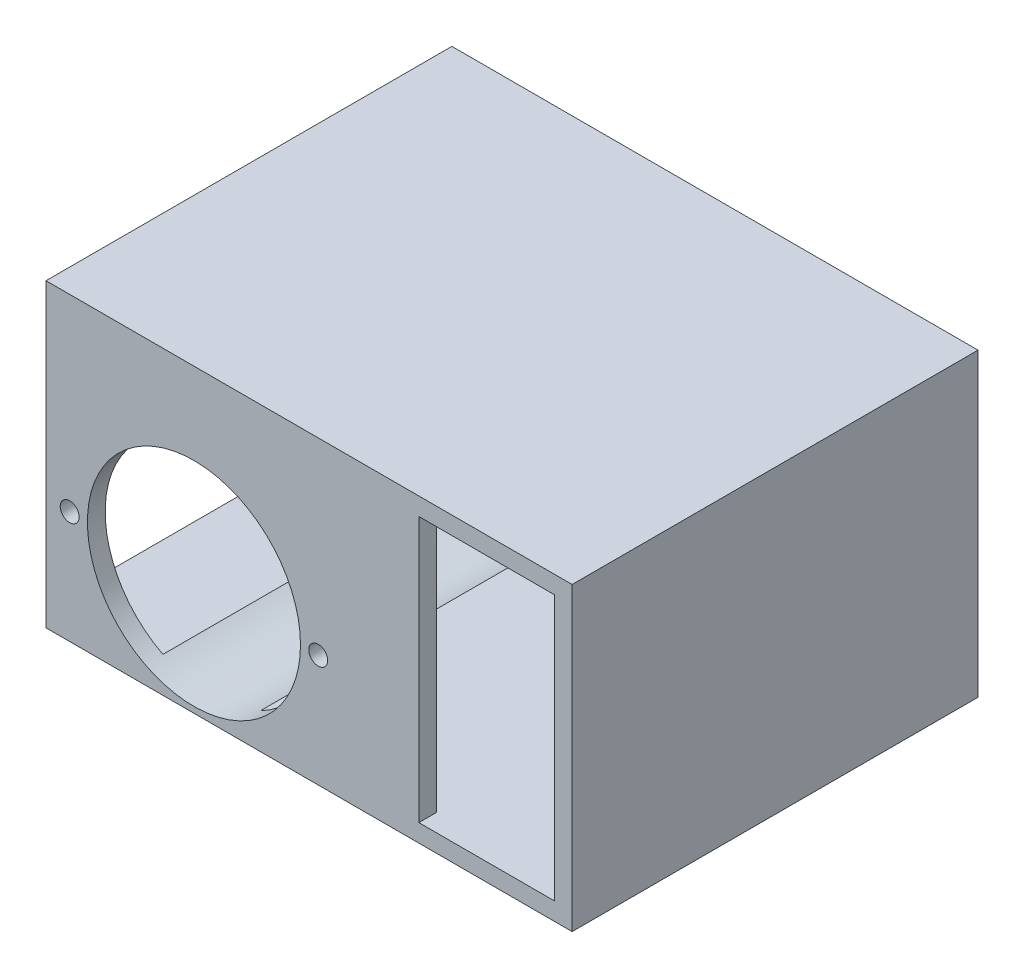
ISO-10303-21;
HEADER;
FILE_DESCRIPTION(('STEP AP214'),'2;1');
FILE_NAME('part.step','',(''),(''),'','','');
FILE_SCHEMA(('AUTOMOTIVE_DESIGN { 1 0 10303 214 1 1 1 1 }'));
ENDSEC;
DATA;
#1=APPLICATION_CONTEXT('core data for automotive mechanical design processes');
#2=APPLICATION_PROTOCOL_DEFINITION('international standard','automotive_design',2000,#1);
#3=PRODUCT_CONTEXT('',#1,'mechanical');
#4=PRODUCT('Part','Part','',(#3));
#5=PRODUCT_RELATED_PRODUCT_CATEGORY('part','',(#4));
#6=PRODUCT_DEFINITION_FORMATION('','',#4);
#7=PRODUCT_DEFINITION_CONTEXT('part definition',#1,'design');
#8=PRODUCT_DEFINITION('design','',#6,#7);
#9=PRODUCT_DEFINITION_SHAPE('','',#8);
#10=(LENGTH_UNIT() NAMED_UNIT(*) SI_UNIT(.MILLI.,.METRE.));
#11=(NAMED_UNIT(*) PLANE_ANGLE_UNIT() SI_UNIT($,.RADIAN.));
#12=(NAMED_UNIT(*) SI_UNIT($,.STERADIAN.) SOLID_ANGLE_UNIT());
#13=UNCERTAINTY_MEASURE_WITH_UNIT(LENGTH_MEASURE(1.E-05),#10,'distance_accuracy_value','');
#14=(GEOMETRIC_REPRESENTATION_CONTEXT(3) GLOBAL_UNCERTAINTY_ASSIGNED_CONTEXT((#13)) GLOBAL_UNIT_ASSIGNED_CONTEXT((#10,
#11,#12)) REPRESENTATION_CONTEXT('',''));
#15=CARTESIAN_POINT('',(0.,0.,0.));
#16=DIRECTION('',(0.,0.,1.));
#17=DIRECTION('',(1.,0.,0.));
#18=AXIS2_PLACEMENT_3D('',#15,#16,#17);
#19=CARTESIAN_POINT('',(4.,19.,-0.420000000000004));
#20=DIRECTION('',(0.,0.,1.));
#21=DIRECTION('',(1.,0.,0.));
#22=AXIS2_PLACEMENT_3D('',#19,#20,#21);
#23=CYLINDRICAL_SURFACE('',#22,1.6);
#24=CARTESIAN_POINT('',(4.,19.,0.));
#25=DIRECTION('',(0.,0.,-1.));
#26=DIRECTION('',(-1.,0.,0.));
#27=AXIS2_PLACEMENT_3D('',#24,#25,#26);
#28=CIRCLE('',#27,1.6);
#29=CARTESIAN_POINT('',(2.4,19.,0.));
#30=VERTEX_POINT('',#29);
#31=EDGE_CURVE('E200',#30,#30,#28,.T.);
#32=ORIENTED_EDGE('',*,*,#31,.T.);
#33=EDGE_LOOP('',(#32));
#34=FACE_BOUND('',#33,.T.);
#35=CARTESIAN_POINT('',(4.,19.,3.));
#36=DIRECTION('',(0.,0.,-1.));
#37=DIRECTION('',(-1.,0.,0.));
#38=AXIS2_PLACEMENT_3D('',#35,#36,#37);
#39=CIRCLE('',#38,1.6);
#40=CARTESIAN_POINT('',(2.4,19.,3.));
#41=VERTEX_POINT('',#40);
#42=EDGE_CURVE('E201',#41,#41,#39,.T.);
#43=ORIENTED_EDGE('',*,*,#42,.F.);
#44=EDGE_LOOP('',(#43));
#45=FACE_BOUND('',#44,.T.);
#46=ADVANCED_FACE('F35',(#34,#45),#23,.F.);
#47=CARTESIAN_POINT('',(0.,3.,68.58));
#48=DIRECTION('',(0.,1.,0.));
#49=DIRECTION('',(0.,0.,1.));
#50=AXIS2_PLACEMENT_3D('',#47,#48,#49);
#51=PLANE('',#50);
#52=DIRECTION('',(1.,0.,0.));
#53=VECTOR('',#52,1.);
#54=CARTESIAN_POINT('',(0.,3.,65.58));
#55=LINE('',#54,#53);
#56=CARTESIAN_POINT('',(0.,3.,65.58));
#57=VERTEX_POINT('',#56);
#58=CARTESIAN_POINT('',(16.7537887487647,3.,65.58));
#59=VERTEX_POINT('',#58);
#60=EDGE_CURVE('E137',#57,#59,#55,.T.);
#61=ORIENTED_EDGE('',*,*,#60,.T.);
#62=DIRECTION('',(0.,0.,1.));
#63=VECTOR('',#62,1.);
#64=CARTESIAN_POINT('',(16.7537887487647,3.,-0.420000000000004));
#65=LINE('',#64,#63);
#66=CARTESIAN_POINT('',(16.7537887487646,3.,3.));
#67=VERTEX_POINT('',#66);
#68=EDGE_CURVE('E213',#67,#59,#65,.T.);
#69=ORIENTED_EDGE('',*,*,#68,.F.);
#70=DIRECTION('',(1.,0.,0.));
#71=VECTOR('',#70,1.);
#72=CARTESIAN_POINT('',(0.,3.,3.));
#73=LINE('',#72,#71);
#74=CARTESIAN_POINT('',(0.,3.,3.));
#75=VERTEX_POINT('',#74);
#76=EDGE_CURVE('E50',#75,#67,#73,.T.);
#77=ORIENTED_EDGE('',*,*,#76,.F.);
#78=DIRECTION('',(0.,0.,1.));
#79=VECTOR('',#78,1.);
#80=CARTESIAN_POINT('',(0.,3.,3.00000000000001));
#81=LINE('',#80,#79);
#82=EDGE_CURVE('E151',#75,#57,#81,.T.);
#83=ORIENTED_EDGE('',*,*,#82,.T.);
#84=EDGE_LOOP('',(#61,#69,#77,#83));
#85=FACE_BOUND('',#84,.T.);
#86=ADVANCED_FACE('F152',(#85),#51,.T.);
#87=CARTESIAN_POINT('',(33.2462112512354,3.,65.58));
#88=VERTEX_POINT('',#87);
#89=CARTESIAN_POINT('',(63.,3.,65.58));
#90=VERTEX_POINT('',#89);
#91=EDGE_CURVE('E148',#88,#90,#55,.T.);
#92=ORIENTED_EDGE('',*,*,#91,.T.);
#93=DIRECTION('',(0.,0.,1.));
#94=VECTOR('',#93,1.);
#95=CARTESIAN_POINT('',(63.,3.,-0.420000000000004));
#96=LINE('',#95,#94);
#97=CARTESIAN_POINT('',(63.,3.,68.58));
#98=VERTEX_POINT('',#97);
#99=EDGE_CURVE('E176',#90,#98,#96,.T.);
#100=ORIENTED_EDGE('',*,*,#99,.T.);
#101=DIRECTION('',(1.,0.,0.));
#102=VECTOR('',#101,1.);
#103=CARTESIAN_POINT('',(63.,3.,68.58));
#104=LINE('',#103,#102);
#105=CARTESIAN_POINT('',(85.9,3.,68.58));
#106=VERTEX_POINT('',#105);
#107=EDGE_CURVE('E167',#98,#106,#104,.T.);
#108=ORIENTED_EDGE('',*,*,#107,.T.);
#109=DIRECTION('',(0.,0.,-1.));
#110=VECTOR('',#109,1.);
#111=CARTESIAN_POINT('',(85.9,3.,68.58));
#112=LINE('',#111,#110);
#113=CARTESIAN_POINT('',(85.9,3.,0.));
#114=VERTEX_POINT('',#113);
#115=EDGE_CURVE('E256',#106,#114,#112,.T.);
#116=ORIENTED_EDGE('',*,*,#115,.T.);
#117=DIRECTION('',(-1.,0.,0.));
#118=VECTOR('',#117,1.);
#119=CARTESIAN_POINT('',(0.,3.,0.));
#120=LINE('',#119,#118);
#121=CARTESIAN_POINT('',(63.,3.,0.));
#122=VERTEX_POINT('',#121);
#123=EDGE_CURVE('E260',#114,#122,#120,.T.);
#124=ORIENTED_EDGE('',*,*,#123,.T.);
#125=CARTESIAN_POINT('',(63.,3.,3.));
#126=VERTEX_POINT('',#125);
#127=EDGE_CURVE('E58',#122,#126,#96,.T.);
#128=ORIENTED_EDGE('',*,*,#127,.T.);
#129=CARTESIAN_POINT('',(33.2462112512354,3.,3.));
#130=VERTEX_POINT('',#129);
#131=EDGE_CURVE('E249',#130,#126,#73,.T.);
#132=ORIENTED_EDGE('',*,*,#131,.F.);
#133=DIRECTION('',(0.,0.,1.));
#134=VECTOR('',#133,1.);
#135=CARTESIAN_POINT('',(33.2462112512354,3.,-0.420000000000004));
#136=LINE('',#135,#134);
#137=EDGE_CURVE('E210',#88,#130,#136,.F.);
#138=ORIENTED_EDGE('',*,*,#137,.F.);
#139=EDGE_LOOP('',(#92,#100,#108,#116,#124,#128,#132,#138));
#140=FACE_BOUND('',#139,.T.);
#141=ADVANCED_FACE('F294',(#140),#51,.T.);
#142=CARTESIAN_POINT('',(85.9,0.,68.58));
#143=DIRECTION('',(-1.,0.,0.));
#144=DIRECTION('',(0.,0.,1.));
#145=AXIS2_PLACEMENT_3D('',#142,#143,#144);
#146=PLANE('',#145);
#147=DIRECTION('',(0.,0.,-1.));
#148=VECTOR('',#147,1.);
#149=CARTESIAN_POINT('',(85.9,47.8,68.58));
#150=LINE('',#149,#148);
#151=CARTESIAN_POINT('',(85.9,47.8,68.58));
#152=VERTEX_POINT('',#151);
#153=CARTESIAN_POINT('',(85.9,47.8,0.));
#154=VERTEX_POINT('',#153);
#155=EDGE_CURVE('E252',#152,#154,#150,.T.);
#156=ORIENTED_EDGE('',*,*,#155,.T.);
#157=DIRECTION('',(0.,-1.,0.));
#158=VECTOR('',#157,1.);
#159=CARTESIAN_POINT('',(85.9,50.8,0.));
#160=LINE('',#159,#158);
#161=EDGE_CURVE('E266',#154,#114,#160,.T.);
#162=ORIENTED_EDGE('',*,*,#161,.T.);
#163=ORIENTED_EDGE('',*,*,#115,.F.);
#164=DIRECTION('',(0.,1.,0.));
#165=VECTOR('',#164,1.);
#166=CARTESIAN_POINT('',(85.9,47.8,68.58));
#167=LINE('',#166,#165);
#168=EDGE_CURVE('E170',#106,#152,#167,.T.);
#169=ORIENTED_EDGE('',*,*,#168,.T.);
#170=EDGE_LOOP('',(#156,#162,#163,#169));
#171=FACE_BOUND('',#170,.T.);
#172=ADVANCED_FACE('F281',(#171),#146,.T.);
#173=CARTESIAN_POINT('',(0.,47.8,68.58));
#174=DIRECTION('',(0.,-1.,0.));
#175=DIRECTION('',(0.,0.,-1.));
#176=AXIS2_PLACEMENT_3D('',#173,#174,#175);
#177=PLANE('',#176);
#178=DIRECTION('',(0.,0.,-1.));
#179=VECTOR('',#178,1.);
#180=CARTESIAN_POINT('',(0.,47.8,3.));
#181=LINE('',#180,#179);
#182=CARTESIAN_POINT('',(0.,47.8,65.58));
#183=VERTEX_POINT('',#182);
#184=CARTESIAN_POINT('',(0.,47.8,3.));
#185=VERTEX_POINT('',#184);
#186=EDGE_CURVE('E160',#183,#185,#181,.T.);
#187=ORIENTED_EDGE('',*,*,#186,.T.);
#188=DIRECTION('',(-1.,0.,0.));
#189=VECTOR('',#188,1.);
#190=CARTESIAN_POINT('',(0.,47.8,3.));
#191=LINE('',#190,#189);
#192=CARTESIAN_POINT('',(63.,47.8,3.));
#193=VERTEX_POINT('',#192);
#194=EDGE_CURVE('E254',#193,#185,#191,.T.);
#195=ORIENTED_EDGE('',*,*,#194,.F.);
#196=DIRECTION('',(0.,0.,1.));
#197=VECTOR('',#196,1.);
#198=CARTESIAN_POINT('',(63.,47.8,-0.420000000000004));
#199=LINE('',#198,#197);
#200=CARTESIAN_POINT('',(63.,47.8,0.));
#201=VERTEX_POINT('',#200);
#202=EDGE_CURVE('E179',#201,#193,#199,.T.);
#203=ORIENTED_EDGE('',*,*,#202,.F.);
#204=DIRECTION('',(1.,0.,0.));
#205=VECTOR('',#204,1.);
#206=CARTESIAN_POINT('',(0.,47.8,0.));
#207=LINE('',#206,#205);
#208=EDGE_CURVE('E43',#201,#154,#207,.T.);
#209=ORIENTED_EDGE('',*,*,#208,.T.);
#210=ORIENTED_EDGE('',*,*,#155,.F.);
#211=DIRECTION('',(-1.,0.,0.));
#212=VECTOR('',#211,1.);
#213=CARTESIAN_POINT('',(63.,47.8,68.58));
#214=LINE('',#213,#212);
#215=CARTESIAN_POINT('',(63.,47.8,68.58));
#216=VERTEX_POINT('',#215);
#217=EDGE_CURVE('E173',#152,#216,#214,.T.);
#218=ORIENTED_EDGE('',*,*,#217,.T.);
#219=CARTESIAN_POINT('',(63.,47.8,65.58));
#220=VERTEX_POINT('',#219);
#221=EDGE_CURVE('E177',#220,#216,#199,.T.);
#222=ORIENTED_EDGE('',*,*,#221,.F.);
#223=DIRECTION('',(-1.,0.,0.));
#224=VECTOR('',#223,1.);
#225=CARTESIAN_POINT('',(0.,47.8,65.58));
#226=LINE('',#225,#224);
#227=EDGE_CURVE('E147',#220,#183,#226,.T.);
#228=ORIENTED_EDGE('',*,*,#227,.T.);
#229=EDGE_LOOP('',(#187,#195,#203,#209,#210,#218,#222,#228));
#230=FACE_BOUND('',#229,.T.);
#231=ADVANCED_FACE('F273',(#230),#177,.T.);
#232=CARTESIAN_POINT('',(0.,50.8,65.58));
#233=DIRECTION('',(0.,0.,-1.));
#234=DIRECTION('',(-1.,0.,0.));
#235=AXIS2_PLACEMENT_3D('',#232,#233,#234);
#236=PLANE('',#235);
#237=CARTESIAN_POINT('',(4.,19.,65.58));
#238=DIRECTION('',(0.,0.,-1.));
#239=DIRECTION('',(-1.,0.,0.));
#240=AXIS2_PLACEMENT_3D('',#237,#238,#239);
#241=CIRCLE('',#240,1.6);
#242=CARTESIAN_POINT('',(2.4,19.,65.58));
#243=VERTEX_POINT('',#242);
#244=EDGE_CURVE('E204',#243,#243,#241,.T.);
#245=ORIENTED_EDGE('',*,*,#244,.F.);
#246=EDGE_LOOP('',(#245));
#247=FACE_BOUND('',#246,.T.);
#248=ORIENTED_EDGE('',*,*,#91,.F.);
#249=CARTESIAN_POINT('',(25.,19.,65.58));
#250=DIRECTION('',(0.,0.,-1.));
#251=DIRECTION('',(-1.,0.,0.));
#252=AXIS2_PLACEMENT_3D('',#249,#250,#251);
#253=CIRCLE('',#252,18.);
#254=EDGE_CURVE('E145',#59,#88,#253,.T.);
#255=ORIENTED_EDGE('',*,*,#254,.F.);
#256=ORIENTED_EDGE('',*,*,#60,.F.);
#257=DIRECTION('',(0.,1.,0.));
#258=VECTOR('',#257,1.);
#259=CARTESIAN_POINT('',(0.,47.8,65.58));
#260=LINE('',#259,#258);
#261=EDGE_CURVE('E143',#57,#183,#260,.T.);
#262=ORIENTED_EDGE('',*,*,#261,.T.);
#263=ORIENTED_EDGE('',*,*,#227,.F.);
#264=DIRECTION('',(0.,1.,0.));
#265=VECTOR('',#264,1.);
#266=CARTESIAN_POINT('',(63.,50.8,65.58));
#267=LINE('',#266,#265);
#268=EDGE_CURVE('E185',#90,#220,#267,.T.);
#269=ORIENTED_EDGE('',*,*,#268,.F.);
#270=EDGE_LOOP('',(#248,#255,#256,#262,#263,#269));
#271=FACE_BOUND('',#270,.T.);
#272=CARTESIAN_POINT('',(46.,19.,65.58));
#273=DIRECTION('',(0.,0.,-1.));
#274=DIRECTION('',(-1.,0.,0.));
#275=AXIS2_PLACEMENT_3D('',#272,#273,#274);
#276=CIRCLE('',#275,1.6);
#277=CARTESIAN_POINT('',(44.4,19.,65.58));
#278=VERTEX_POINT('',#277);
#279=EDGE_CURVE('E194',#278,#278,#276,.T.);
#280=ORIENTED_EDGE('',*,*,#279,.F.);
#281=EDGE_LOOP('',(#280));
#282=FACE_BOUND('',#281,.T.);
#283=ADVANCED_FACE('F139',(#247,#271,#282),#236,.T.);
#284=CARTESIAN_POINT('',(0.,50.8,3.));
#285=DIRECTION('',(0.,0.,-1.));
#286=DIRECTION('',(-1.,0.,0.));
#287=AXIS2_PLACEMENT_3D('',#284,#285,#286);
#288=PLANE('',#287);
#289=ORIENTED_EDGE('',*,*,#42,.T.);
#290=EDGE_LOOP('',(#289));
#291=FACE_BOUND('',#290,.T.);
#292=ORIENTED_EDGE('',*,*,#76,.T.);
#293=CARTESIAN_POINT('',(25.,19.,3.));
#294=DIRECTION('',(0.,0.,-1.));
#295=DIRECTION('',(-1.,0.,0.));
#296=AXIS2_PLACEMENT_3D('',#293,#294,#295);
#297=CIRCLE('',#296,18.);
#298=EDGE_CURVE('E250',#67,#130,#297,.T.);
#299=ORIENTED_EDGE('',*,*,#298,.T.);
#300=ORIENTED_EDGE('',*,*,#131,.T.);
#301=DIRECTION('',(0.,1.,0.));
#302=VECTOR('',#301,1.);
#303=CARTESIAN_POINT('',(63.,50.8,3.));
#304=LINE('',#303,#302);
#305=EDGE_CURVE('E182',#126,#193,#304,.T.);
#306=ORIENTED_EDGE('',*,*,#305,.T.);
#307=ORIENTED_EDGE('',*,*,#194,.T.);
#308=DIRECTION('',(0.,-1.,0.));
#309=VECTOR('',#308,1.);
#310=CARTESIAN_POINT('',(0.,47.8,3.));
#311=LINE('',#310,#309);
#312=EDGE_CURVE('E155',#185,#75,#311,.T.);
#313=ORIENTED_EDGE('',*,*,#312,.T.);
#314=EDGE_LOOP('',(#292,#299,#300,#306,#307,#313));
#315=FACE_BOUND('',#314,.T.);
#316=CARTESIAN_POINT('',(46.,19.,3.));
#317=DIRECTION('',(0.,0.,-1.));
#318=DIRECTION('',(-1.,0.,0.));
#319=AXIS2_PLACEMENT_3D('',#316,#317,#318);
#320=CIRCLE('',#319,1.6);
#321=CARTESIAN_POINT('',(44.4,19.,3.));
#322=VERTEX_POINT('',#321);
#323=EDGE_CURVE('E191',#322,#322,#320,.T.);
#324=ORIENTED_EDGE('',*,*,#323,.T.);
#325=EDGE_LOOP('',(#324));
#326=FACE_BOUND('',#325,.T.);
#327=ADVANCED_FACE('F37',(#291,#315,#326),#288,.F.);
#328=CARTESIAN_POINT('',(25.,19.,-0.420000000000004));
#329=DIRECTION('',(0.,0.,1.));
#330=DIRECTION('',(1.,0.,0.));
#331=AXIS2_PLACEMENT_3D('',#328,#329,#330);
#332=CYLINDRICAL_SURFACE('',#331,18.);
#333=CARTESIAN_POINT('',(25.,19.,0.));
#334=DIRECTION('',(0.,0.,-1.));
#335=DIRECTION('',(-1.,0.,0.));
#336=AXIS2_PLACEMENT_3D('',#333,#334,#335);
#337=CIRCLE('',#336,18.);
#338=CARTESIAN_POINT('',(6.99999999999999,19.,0.));
#339=VERTEX_POINT('',#338);
#340=EDGE_CURVE('E216',#339,#339,#337,.T.);
#341=ORIENTED_EDGE('',*,*,#340,.T.);
#342=EDGE_LOOP('',(#341));
#343=FACE_BOUND('',#342,.T.);
#344=ORIENTED_EDGE('',*,*,#254,.T.);
#345=ORIENTED_EDGE('',*,*,#137,.T.);
#346=ORIENTED_EDGE('',*,*,#298,.F.);
#347=ORIENTED_EDGE('',*,*,#68,.T.);
#348=EDGE_LOOP('',(#344,#345,#346,#347));
#349=FACE_BOUND('',#348,.T.);
#350=CARTESIAN_POINT('',(25.,19.,68.58));
#351=DIRECTION('',(0.,0.,1.));
#352=DIRECTION('',(1.,0.,0.));
#353=AXIS2_PLACEMENT_3D('',#350,#351,#352);
#354=CIRCLE('',#353,18.);
#355=CARTESIAN_POINT('',(43.,19.,68.58));
#356=VERTEX_POINT('',#355);
#357=EDGE_CURVE('E207',#356,#356,#354,.T.);
#358=ORIENTED_EDGE('',*,*,#357,.T.);
#359=EDGE_LOOP('',(#358));
#360=FACE_BOUND('',#359,.T.);
#361=ADVANCED_FACE('F298',(#343,#349,#360),#332,.F.);
#362=CARTESIAN_POINT('',(0.,0.,68.58));
#363=DIRECTION('',(1.,0.,0.));
#364=DIRECTION('',(0.,0.,-1.));
#365=AXIS2_PLACEMENT_3D('',#362,#363,#364);
#366=PLANE('',#365);
#367=ORIENTED_EDGE('',*,*,#82,.F.);
#368=ORIENTED_EDGE('',*,*,#312,.F.);
#369=ORIENTED_EDGE('',*,*,#186,.F.);
#370=ORIENTED_EDGE('',*,*,#261,.F.);
#371=EDGE_LOOP('',(#367,#368,#369,#370));
#372=FACE_BOUND('',#371,.T.);
#373=DIRECTION('',(0.,-1.,0.));
#374=VECTOR('',#373,1.);
#375=CARTESIAN_POINT('',(0.,0.,0.));
#376=LINE('',#375,#374);
#377=CARTESIAN_POINT('',(0.,50.8,0.));
#378=VERTEX_POINT('',#377);
#379=CARTESIAN_POINT('',(0.,0.,0.));
#380=VERTEX_POINT('',#379);
#381=EDGE_CURVE('E219',#378,#380,#376,.T.);
#382=ORIENTED_EDGE('',*,*,#381,.T.);
#383=DIRECTION('',(0.,0.,-1.));
#384=VECTOR('',#383,1.);
#385=CARTESIAN_POINT('',(0.,0.,68.58));
#386=LINE('',#385,#384);
#387=CARTESIAN_POINT('',(0.,0.,68.58));
#388=VERTEX_POINT('',#387);
#389=EDGE_CURVE('E246',#388,#380,#386,.T.);
#390=ORIENTED_EDGE('',*,*,#389,.F.);
#391=DIRECTION('',(0.,-1.,0.));
#392=VECTOR('',#391,1.);
#393=CARTESIAN_POINT('',(0.,0.,68.58));
#394=LINE('',#393,#392);
#395=CARTESIAN_POINT('',(0.,50.8,68.58));
#396=VERTEX_POINT('',#395);
#397=EDGE_CURVE('E220',#396,#388,#394,.T.);
#398=ORIENTED_EDGE('',*,*,#397,.F.);
#399=DIRECTION('',(0.,0.,-1.));
#400=VECTOR('',#399,1.);
#401=CARTESIAN_POINT('',(0.,50.8,68.58));
#402=LINE('',#401,#400);
#403=EDGE_CURVE('E230',#396,#378,#402,.T.);
#404=ORIENTED_EDGE('',*,*,#403,.T.);
#405=EDGE_LOOP('',(#382,#390,#398,#404));
#406=FACE_BOUND('',#405,.T.);
#407=ADVANCED_FACE('F157',(#372,#406),#366,.F.);
#408=CARTESIAN_POINT('',(0.,0.,68.58));
#409=DIRECTION('',(0.,1.,0.));
#410=DIRECTION('',(0.,0.,1.));
#411=AXIS2_PLACEMENT_3D('',#408,#409,#410);
#412=PLANE('',#411);
#413=DIRECTION('',(1.,0.,0.));
#414=VECTOR('',#413,1.);
#415=CARTESIAN_POINT('',(0.,0.,0.));
#416=LINE('',#415,#414);
#417=CARTESIAN_POINT('',(88.9,0.,0.));
#418=VERTEX_POINT('',#417);
#419=EDGE_CURVE('E233',#380,#418,#416,.T.);
#420=ORIENTED_EDGE('',*,*,#419,.T.);
#421=DIRECTION('',(0.,0.,-1.));
#422=VECTOR('',#421,1.);
#423=CARTESIAN_POINT('',(88.9,0.,68.58));
#424=LINE('',#423,#422);
#425=CARTESIAN_POINT('',(88.9,0.,68.58));
#426=VERTEX_POINT('',#425);
#427=EDGE_CURVE('E243',#426,#418,#424,.T.);
#428=ORIENTED_EDGE('',*,*,#427,.F.);
#429=DIRECTION('',(1.,0.,0.));
#430=VECTOR('',#429,1.);
#431=CARTESIAN_POINT('',(0.,0.,68.58));
#432=LINE('',#431,#430);
#433=EDGE_CURVE('E223',#388,#426,#432,.T.);
#434=ORIENTED_EDGE('',*,*,#433,.F.);
#435=ORIENTED_EDGE('',*,*,#389,.T.);
#436=EDGE_LOOP('',(#420,#428,#434,#435));
#437=FACE_BOUND('',#436,.T.);
#438=ADVANCED_FACE('F350',(#437),#412,.F.);
#439=CARTESIAN_POINT('',(88.9,0.,68.58));
#440=DIRECTION('',(-1.,0.,0.));
#441=DIRECTION('',(0.,0.,1.));
#442=AXIS2_PLACEMENT_3D('',#439,#440,#441);
#443=PLANE('',#442);
#444=DIRECTION('',(0.,1.,0.));
#445=VECTOR('',#444,1.);
#446=CARTESIAN_POINT('',(88.9,0.,0.));
#447=LINE('',#446,#445);
#448=CARTESIAN_POINT('',(88.9,50.8,0.));
#449=VERTEX_POINT('',#448);
#450=EDGE_CURVE('E235',#418,#449,#447,.T.);
#451=ORIENTED_EDGE('',*,*,#450,.T.);
#452=DIRECTION('',(0.,0.,-1.));
#453=VECTOR('',#452,1.);
#454=CARTESIAN_POINT('',(88.9,50.8,68.58));
#455=LINE('',#454,#453);
#456=CARTESIAN_POINT('',(88.9,50.8,68.58));
#457=VERTEX_POINT('',#456);
#458=EDGE_CURVE('E240',#457,#449,#455,.T.);
#459=ORIENTED_EDGE('',*,*,#458,.F.);
#460=DIRECTION('',(0.,1.,0.));
#461=VECTOR('',#460,1.);
#462=CARTESIAN_POINT('',(88.9,0.,68.58));
#463=LINE('',#462,#461);
#464=EDGE_CURVE('E226',#426,#457,#463,.T.);
#465=ORIENTED_EDGE('',*,*,#464,.F.);
#466=ORIENTED_EDGE('',*,*,#427,.T.);
#467=EDGE_LOOP('',(#451,#459,#465,#466));
#468=FACE_BOUND('',#467,.T.);
#469=ADVANCED_FACE('F355',(#468),#443,.F.);
#470=CARTESIAN_POINT('',(0.,50.8,68.58));
#471=DIRECTION('',(0.,-1.,0.));
#472=DIRECTION('',(0.,0.,-1.));
#473=AXIS2_PLACEMENT_3D('',#470,#471,#472);
#474=PLANE('',#473);
#475=DIRECTION('',(-1.,0.,0.));
#476=VECTOR('',#475,1.);
#477=CARTESIAN_POINT('',(0.,50.8,0.));
#478=LINE('',#477,#476);
#479=EDGE_CURVE('E224',#449,#378,#478,.T.);
#480=ORIENTED_EDGE('',*,*,#479,.T.);
#481=ORIENTED_EDGE('',*,*,#403,.F.);
#482=DIRECTION('',(-1.,0.,0.));
#483=VECTOR('',#482,1.);
#484=CARTESIAN_POINT('',(0.,50.8,68.58));
#485=LINE('',#484,#483);
#486=EDGE_CURVE('E228',#457,#396,#485,.T.);
#487=ORIENTED_EDGE('',*,*,#486,.F.);
#488=ORIENTED_EDGE('',*,*,#458,.T.);
#489=EDGE_LOOP('',(#480,#481,#487,#488));
#490=FACE_BOUND('',#489,.T.);
#491=ADVANCED_FACE('F339',(#490),#474,.F.);
#492=CARTESIAN_POINT('',(0.,50.8,68.58));
#493=DIRECTION('',(0.,0.,-1.));
#494=DIRECTION('',(-1.,0.,0.));
#495=AXIS2_PLACEMENT_3D('',#492,#493,#494);
#496=PLANE('',#495);
#497=ORIENTED_EDGE('',*,*,#107,.F.);
#498=DIRECTION('',(0.,-1.,0.));
#499=VECTOR('',#498,1.);
#500=CARTESIAN_POINT('',(63.,47.8,68.58));
#501=LINE('',#500,#499);
#502=EDGE_CURVE('E162',#216,#98,#501,.T.);
#503=ORIENTED_EDGE('',*,*,#502,.F.);
#504=ORIENTED_EDGE('',*,*,#217,.F.);
#505=ORIENTED_EDGE('',*,*,#168,.F.);
#506=EDGE_LOOP('',(#497,#503,#504,#505));
#507=FACE_BOUND('',#506,.T.);
#508=CARTESIAN_POINT('',(46.,19.,68.58));
#509=DIRECTION('',(0.,0.,1.));
#510=DIRECTION('',(1.,0.,0.));
#511=AXIS2_PLACEMENT_3D('',#508,#509,#510);
#512=CIRCLE('',#511,1.6);
#513=CARTESIAN_POINT('',(47.6,19.,68.58));
#514=VERTEX_POINT('',#513);
#515=EDGE_CURVE('E187',#514,#514,#512,.T.);
#516=ORIENTED_EDGE('',*,*,#515,.F.);
#517=EDGE_LOOP('',(#516));
#518=FACE_BOUND('',#517,.T.);
#519=CARTESIAN_POINT('',(4.,19.,68.58));
#520=DIRECTION('',(0.,0.,1.));
#521=DIRECTION('',(1.,0.,0.));
#522=AXIS2_PLACEMENT_3D('',#519,#520,#521);
#523=CIRCLE('',#522,1.6);
#524=CARTESIAN_POINT('',(5.6,19.,68.58));
#525=VERTEX_POINT('',#524);
#526=EDGE_CURVE('E197',#525,#525,#523,.T.);
#527=ORIENTED_EDGE('',*,*,#526,.F.);
#528=EDGE_LOOP('',(#527));
#529=FACE_BOUND('',#528,.T.);
#530=ORIENTED_EDGE('',*,*,#357,.F.);
#531=EDGE_LOOP('',(#530));
#532=FACE_BOUND('',#531,.T.);
#533=ORIENTED_EDGE('',*,*,#397,.T.);
#534=ORIENTED_EDGE('',*,*,#433,.T.);
#535=ORIENTED_EDGE('',*,*,#464,.T.);
#536=ORIENTED_EDGE('',*,*,#486,.T.);
#537=EDGE_LOOP('',(#533,#534,#535,#536));
#538=FACE_BOUND('',#537,.T.);
#539=ADVANCED_FACE('F287',(#507,#518,#529,#532,#538),#496,.F.);
#540=CARTESIAN_POINT('',(0.,50.8,0.));
#541=DIRECTION('',(0.,0.,-1.));
#542=DIRECTION('',(-1.,0.,0.));
#543=AXIS2_PLACEMENT_3D('',#540,#541,#542);
#544=PLANE('',#543);
#545=DIRECTION('',(0.,1.,0.));
#546=VECTOR('',#545,1.);
#547=CARTESIAN_POINT('',(63.,50.8,0.));
#548=LINE('',#547,#546);
#549=EDGE_CURVE('E11',#122,#201,#548,.T.);
#550=ORIENTED_EDGE('',*,*,#549,.F.);
#551=ORIENTED_EDGE('',*,*,#123,.F.);
#552=ORIENTED_EDGE('',*,*,#161,.F.);
#553=ORIENTED_EDGE('',*,*,#208,.F.);
#554=EDGE_LOOP('',(#550,#551,#552,#553));
#555=FACE_BOUND('',#554,.T.);
#556=CARTESIAN_POINT('',(46.,19.,0.));
#557=DIRECTION('',(0.,0.,-1.));
#558=DIRECTION('',(-1.,0.,0.));
#559=AXIS2_PLACEMENT_3D('',#556,#557,#558);
#560=CIRCLE('',#559,1.6);
#561=CARTESIAN_POINT('',(44.4,19.,0.));
#562=VERTEX_POINT('',#561);
#563=EDGE_CURVE('E190',#562,#562,#560,.T.);
#564=ORIENTED_EDGE('',*,*,#563,.F.);
#565=EDGE_LOOP('',(#564));
#566=FACE_BOUND('',#565,.T.);
#567=ORIENTED_EDGE('',*,*,#31,.F.);
#568=EDGE_LOOP('',(#567));
#569=FACE_BOUND('',#568,.T.);
#570=ORIENTED_EDGE('',*,*,#340,.F.);
#571=EDGE_LOOP('',(#570));
#572=FACE_BOUND('',#571,.T.);
#573=ORIENTED_EDGE('',*,*,#381,.F.);
#574=ORIENTED_EDGE('',*,*,#479,.F.);
#575=ORIENTED_EDGE('',*,*,#450,.F.);
#576=ORIENTED_EDGE('',*,*,#419,.F.);
#577=EDGE_LOOP('',(#573,#574,#575,#576));
#578=FACE_BOUND('',#577,.T.);
#579=ADVANCED_FACE('F278',(#555,#566,#569,#572,#578),#544,.T.);
#580=ORIENTED_EDGE('',*,*,#244,.T.);
#581=EDGE_LOOP('',(#580));
#582=FACE_BOUND('',#581,.T.);
#583=ORIENTED_EDGE('',*,*,#526,.T.);
#584=EDGE_LOOP('',(#583));
#585=FACE_BOUND('',#584,.T.);
#586=ADVANCED_FACE('F318',(#582,#585),#23,.F.);
#587=CARTESIAN_POINT('',(46.,19.,-0.420000000000004));
#588=DIRECTION('',(0.,0.,1.));
#589=DIRECTION('',(1.,0.,0.));
#590=AXIS2_PLACEMENT_3D('',#587,#588,#589);
#591=CYLINDRICAL_SURFACE('',#590,1.6);
#592=ORIENTED_EDGE('',*,*,#563,.T.);
#593=EDGE_LOOP('',(#592));
#594=FACE_BOUND('',#593,.T.);
#595=ORIENTED_EDGE('',*,*,#323,.F.);
#596=EDGE_LOOP('',(#595));
#597=FACE_BOUND('',#596,.T.);
#598=ADVANCED_FACE('F312',(#594,#597),#591,.F.);
#599=ORIENTED_EDGE('',*,*,#279,.T.);
#600=EDGE_LOOP('',(#599));
#601=FACE_BOUND('',#600,.T.);
#602=ORIENTED_EDGE('',*,*,#515,.T.);
#603=EDGE_LOOP('',(#602));
#604=FACE_BOUND('',#603,.T.);
#605=ADVANCED_FACE('F306',(#601,#604),#591,.F.);
#606=CARTESIAN_POINT('',(63.,47.8,-0.420000000000004));
#607=DIRECTION('',(-1.,0.,0.));
#608=DIRECTION('',(0.,0.,1.));
#609=AXIS2_PLACEMENT_3D('',#606,#607,#608);
#610=PLANE('',#609);
#611=ORIENTED_EDGE('',*,*,#127,.F.);
#612=ORIENTED_EDGE('',*,*,#549,.T.);
#613=ORIENTED_EDGE('',*,*,#202,.T.);
#614=ORIENTED_EDGE('',*,*,#305,.F.);
#615=EDGE_LOOP('',(#611,#612,#613,#614));
#616=FACE_BOUND('',#615,.T.);
#617=ADVANCED_FACE('F303',(#616),#610,.F.);
#618=ORIENTED_EDGE('',*,*,#268,.T.);
#619=ORIENTED_EDGE('',*,*,#221,.T.);
#620=ORIENTED_EDGE('',*,*,#502,.T.);
#621=ORIENTED_EDGE('',*,*,#99,.F.);
#622=EDGE_LOOP('',(#618,#619,#620,#621));
#623=FACE_BOUND('',#622,.T.);
#624=ADVANCED_FACE('F305',(#623),#610,.F.);
#625=CLOSED_SHELL('',(#46,#86,#141,#172,#231,#283,#327,#361,#407,#438,#469,#491,#539,#579,#586,
#598,#605,#617,#624));
#626=MANIFOLD_SOLID_BREP('B2',#625);
#627=ADVANCED_BREP_SHAPE_REPRESENTATION('',(#18,#626),#14);
#628=SHAPE_DEFINITION_REPRESENTATION(#9,#627);
ENDSEC;
END-ISO-10303-21;
